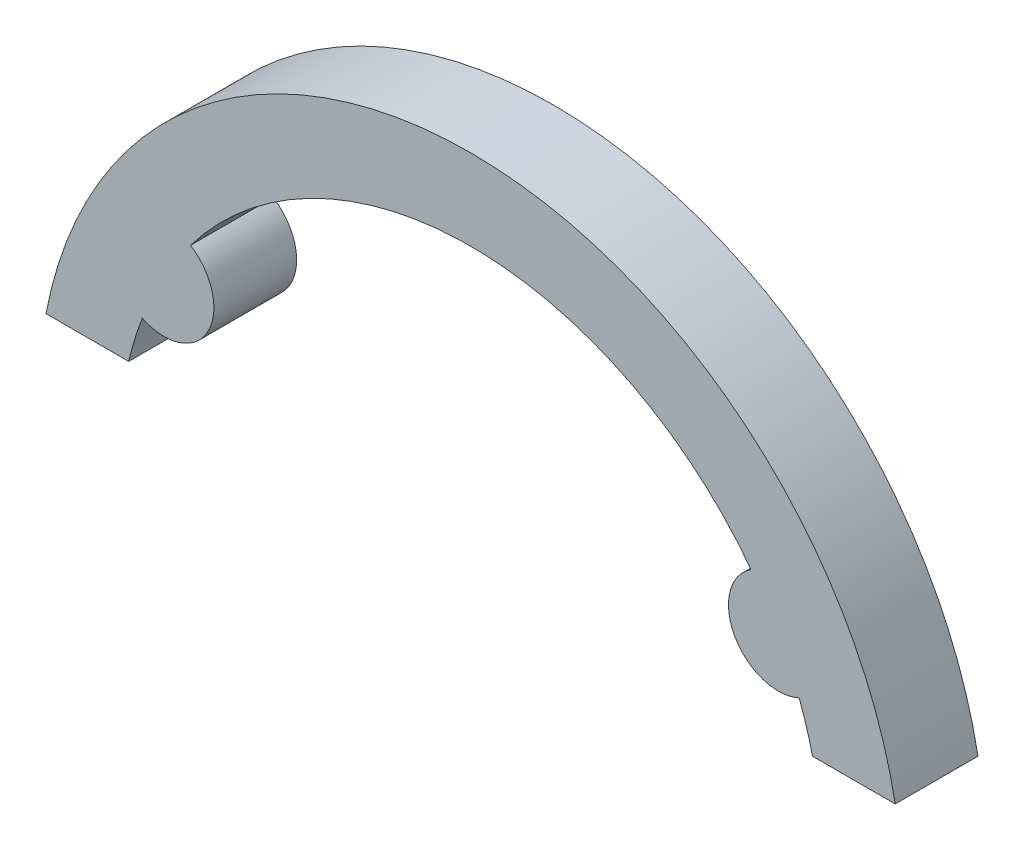
ISO-10303-21;
HEADER;
FILE_DESCRIPTION(('STEP AP214'),'2;1');
FILE_NAME('part.step','',(''),(''),'','','');
FILE_SCHEMA(('AUTOMOTIVE_DESIGN { 1 0 10303 214 1 1 1 1 }'));
ENDSEC;
DATA;
#1=APPLICATION_CONTEXT('core data for automotive mechanical design processes');
#2=APPLICATION_PROTOCOL_DEFINITION('international standard','automotive_design',2000,#1);
#3=PRODUCT_CONTEXT('',#1,'mechanical');
#4=PRODUCT('Part','Part','',(#3));
#5=PRODUCT_RELATED_PRODUCT_CATEGORY('part','',(#4));
#6=PRODUCT_DEFINITION_FORMATION('','',#4);
#7=PRODUCT_DEFINITION_CONTEXT('part definition',#1,'design');
#8=PRODUCT_DEFINITION('design','',#6,#7);
#9=PRODUCT_DEFINITION_SHAPE('','',#8);
#10=(LENGTH_UNIT() NAMED_UNIT(*) SI_UNIT(.MILLI.,.METRE.));
#11=(NAMED_UNIT(*) PLANE_ANGLE_UNIT() SI_UNIT($,.RADIAN.));
#12=(NAMED_UNIT(*) SI_UNIT($,.STERADIAN.) SOLID_ANGLE_UNIT());
#13=UNCERTAINTY_MEASURE_WITH_UNIT(LENGTH_MEASURE(1.E-05),#10,'distance_accuracy_value','');
#14=(GEOMETRIC_REPRESENTATION_CONTEXT(3) GLOBAL_UNCERTAINTY_ASSIGNED_CONTEXT((#13)) GLOBAL_UNIT_ASSIGNED_CONTEXT((#10,
#11,#12)) REPRESENTATION_CONTEXT('',''));
#15=CARTESIAN_POINT('',(0.,0.,0.));
#16=DIRECTION('',(0.,0.,1.));
#17=DIRECTION('',(1.,0.,0.));
#18=AXIS2_PLACEMENT_3D('',#15,#16,#17);
#19=CARTESIAN_POINT('',(-0.0677661190622847,0.102218067751444,9.95532087482453));
#20=DIRECTION('',(0.,0.,-1.));
#21=DIRECTION('',(-1.,0.,0.));
#22=AXIS2_PLACEMENT_3D('',#19,#20,#21);
#23=CYLINDRICAL_SURFACE('',#22,42.2489571991848);
#24=CARTESIAN_POINT('',(-0.0677661190622847,0.102218067751444,0.));
#25=DIRECTION('',(0.,0.,-1.));
#26=DIRECTION('',(-1.,0.,0.));
#27=AXIS2_PLACEMENT_3D('',#24,#25,#26);
#28=CIRCLE('',#27,42.2489571991848);
#29=CARTESIAN_POINT('',(-41.1926744496498,9.78293597601269,0.));
#30=VERTEX_POINT('',#29);
#31=CARTESIAN_POINT('',(-39.5643505188238,15.1020249055432,0.));
#32=VERTEX_POINT('',#31);
#33=EDGE_CURVE('E142',#30,#32,#28,.T.);
#34=ORIENTED_EDGE('',*,*,#33,.T.);
#35=DIRECTION('',(0.,0.,-1.));
#36=VECTOR('',#35,1.);
#37=CARTESIAN_POINT('',(-39.5643505188238,15.1020249055432,9.95532087482453));
#38=LINE('',#37,#36);
#39=CARTESIAN_POINT('',(-39.5643505188238,15.1020249055432,9.95532087482453));
#40=VERTEX_POINT('',#39);
#41=EDGE_CURVE('E11',#40,#32,#38,.T.);
#42=ORIENTED_EDGE('',*,*,#41,.F.);
#43=CARTESIAN_POINT('',(-0.0677661190622847,0.102218067751444,9.95532087482453));
#44=DIRECTION('',(0.,0.,-1.));
#45=DIRECTION('',(-1.,0.,0.));
#46=AXIS2_PLACEMENT_3D('',#43,#44,#45);
#47=CIRCLE('',#46,42.2489571991848);
#48=CARTESIAN_POINT('',(-41.1926744496498,9.78293597601269,9.95532087482453));
#49=VERTEX_POINT('',#48);
#50=EDGE_CURVE('E164',#49,#40,#47,.T.);
#51=ORIENTED_EDGE('',*,*,#50,.F.);
#52=DIRECTION('',(0.,0.,-1.));
#53=VECTOR('',#52,1.);
#54=CARTESIAN_POINT('',(-41.1926744496498,9.78293597601269,9.95532087482453));
#55=LINE('',#54,#53);
#56=EDGE_CURVE('E138',#49,#30,#55,.T.);
#57=ORIENTED_EDGE('',*,*,#56,.T.);
#58=EDGE_LOOP('',(#34,#42,#51,#57));
#59=FACE_BOUND('',#58,.T.);
#60=ADVANCED_FACE('F41',(#59),#23,.F.);
#61=CARTESIAN_POINT('',(-36.9455071674853,20.5003264440968,9.95532087482453));
#62=DIRECTION('',(0.,0.,-1.));
#63=DIRECTION('',(-1.,0.,0.));
#64=AXIS2_PLACEMENT_3D('',#61,#62,#63);
#65=CYLINDRICAL_SURFACE('',#64,5.99999999999999);
#66=CARTESIAN_POINT('',(-36.9455071674853,20.5003264440968,0.));
#67=DIRECTION('',(0.,0.,1.));
#68=DIRECTION('',(-1.,0.,0.));
#69=AXIS2_PLACEMENT_3D('',#66,#67,#68);
#70=CIRCLE('',#69,5.99999999999999);
#71=CARTESIAN_POINT('',(-33.7644557146274,25.5876549821676,0.));
#72=VERTEX_POINT('',#71);
#73=EDGE_CURVE('E146',#32,#72,#70,.T.);
#74=ORIENTED_EDGE('',*,*,#73,.T.);
#75=DIRECTION('',(0.,0.,-1.));
#76=VECTOR('',#75,1.);
#77=CARTESIAN_POINT('',(-33.7644557146274,25.5876549821676,9.95532087482453));
#78=LINE('',#77,#76);
#79=CARTESIAN_POINT('',(-33.7644557146274,25.5876549821676,9.95532087482453));
#80=VERTEX_POINT('',#79);
#81=EDGE_CURVE('E50',#80,#72,#78,.T.);
#82=ORIENTED_EDGE('',*,*,#81,.F.);
#83=CARTESIAN_POINT('',(-36.9455071674853,20.5003264440968,9.95532087482453));
#84=DIRECTION('',(0.,0.,1.));
#85=DIRECTION('',(-1.,0.,0.));
#86=AXIS2_PLACEMENT_3D('',#83,#84,#85);
#87=CIRCLE('',#86,5.99999999999999);
#88=EDGE_CURVE('E101',#40,#80,#87,.T.);
#89=ORIENTED_EDGE('',*,*,#88,.F.);
#90=ORIENTED_EDGE('',*,*,#41,.T.);
#91=EDGE_LOOP('',(#74,#82,#89,#90));
#92=FACE_BOUND('',#91,.T.);
#93=ADVANCED_FACE('F210',(#92),#65,.T.);
#94=CARTESIAN_POINT('',(-0.0677661190622847,0.102218067751444,9.95532087482453));
#95=DIRECTION('',(0.,0.,-1.));
#96=DIRECTION('',(-1.,0.,0.));
#97=AXIS2_PLACEMENT_3D('',#94,#95,#96);
#98=CYLINDRICAL_SURFACE('',#97,42.2489571991848);
#99=CARTESIAN_POINT('',(-0.0677661190622847,0.102218067751444,0.));
#100=DIRECTION('',(0.,0.,-1.));
#101=DIRECTION('',(-1.,0.,0.));
#102=AXIS2_PLACEMENT_3D('',#99,#100,#101);
#103=CIRCLE('',#102,42.2489571991848);
#104=CARTESIAN_POINT('',(33.6708272245596,25.5321552208839,0.));
#105=VERTEX_POINT('',#104);
#106=EDGE_CURVE('E149',#72,#105,#103,.T.);
#107=ORIENTED_EDGE('',*,*,#106,.T.);
#108=DIRECTION('',(0.,0.,-1.));
#109=VECTOR('',#108,1.);
#110=CARTESIAN_POINT('',(33.6708272245596,25.5321552208839,9.95532087482453));
#111=LINE('',#110,#109);
#112=CARTESIAN_POINT('',(33.6708272245596,25.5321552208839,9.95532087482453));
#113=VERTEX_POINT('',#112);
#114=EDGE_CURVE('E175',#113,#105,#111,.T.);
#115=ORIENTED_EDGE('',*,*,#114,.F.);
#116=CARTESIAN_POINT('',(-0.0677661190622847,0.102218067751444,9.95532087482453));
#117=DIRECTION('',(0.,0.,-1.));
#118=DIRECTION('',(-1.,0.,0.));
#119=AXIS2_PLACEMENT_3D('',#116,#117,#118);
#120=CIRCLE('',#119,42.2489571991848);
#121=EDGE_CURVE('E185',#80,#113,#120,.T.);
#122=ORIENTED_EDGE('',*,*,#121,.F.);
#123=ORIENTED_EDGE('',*,*,#81,.T.);
#124=EDGE_LOOP('',(#107,#115,#122,#123));
#125=FACE_BOUND('',#124,.T.);
#126=ADVANCED_FACE('F183',(#125),#98,.F.);
#127=CARTESIAN_POINT('',(36.9467034066052,20.5053634766493,9.95532087482453));
#128=DIRECTION('',(0.,0.,-1.));
#129=DIRECTION('',(-1.,0.,0.));
#130=AXIS2_PLACEMENT_3D('',#127,#128,#129);
#131=CYLINDRICAL_SURFACE('',#130,5.99999999999997);
#132=CARTESIAN_POINT('',(36.9467034066052,20.5053634766493,0.));
#133=DIRECTION('',(0.,0.,1.));
#134=DIRECTION('',(1.,0.,0.));
#135=AXIS2_PLACEMENT_3D('',#132,#133,#134);
#136=CIRCLE('',#135,5.99999999999997);
#137=CARTESIAN_POINT('',(39.4479410799773,15.0515748759329,0.));
#138=VERTEX_POINT('',#137);
#139=EDGE_CURVE('E152',#105,#138,#136,.T.);
#140=ORIENTED_EDGE('',*,*,#139,.T.);
#141=DIRECTION('',(0.,0.,-1.));
#142=VECTOR('',#141,1.);
#143=CARTESIAN_POINT('',(39.4479410799773,15.0515748759329,9.95532087482453));
#144=LINE('',#143,#142);
#145=CARTESIAN_POINT('',(39.4479410799773,15.0515748759329,9.95532087482453));
#146=VERTEX_POINT('',#145);
#147=EDGE_CURVE('E171',#146,#138,#144,.T.);
#148=ORIENTED_EDGE('',*,*,#147,.F.);
#149=CARTESIAN_POINT('',(36.9467034066052,20.5053634766493,9.95532087482453));
#150=DIRECTION('',(0.,0.,1.));
#151=DIRECTION('',(1.,0.,0.));
#152=AXIS2_PLACEMENT_3D('',#149,#150,#151);
#153=CIRCLE('',#152,5.99999999999997);
#154=EDGE_CURVE('E198',#113,#146,#153,.T.);
#155=ORIENTED_EDGE('',*,*,#154,.F.);
#156=ORIENTED_EDGE('',*,*,#114,.T.);
#157=EDGE_LOOP('',(#140,#148,#155,#156));
#158=FACE_BOUND('',#157,.T.);
#159=ADVANCED_FACE('F193',(#158),#131,.T.);
#160=CARTESIAN_POINT('',(-0.0677661190622847,0.102218067751444,9.95532087482453));
#161=DIRECTION('',(0.,0.,-1.));
#162=DIRECTION('',(-1.,0.,0.));
#163=AXIS2_PLACEMENT_3D('',#160,#161,#162);
#164=CYLINDRICAL_SURFACE('',#163,42.2489571991848);
#165=CARTESIAN_POINT('',(-0.0677661190622847,0.102218067751444,0.));
#166=DIRECTION('',(0.,0.,-1.));
#167=DIRECTION('',(-1.,0.,0.));
#168=AXIS2_PLACEMENT_3D('',#165,#166,#167);
#169=CIRCLE('',#168,42.2489571991848);
#170=CARTESIAN_POINT('',(41.0566856908134,9.78487512848466,0.));
#171=VERTEX_POINT('',#170);
#172=EDGE_CURVE('E155',#138,#171,#169,.T.);
#173=ORIENTED_EDGE('',*,*,#172,.T.);
#174=DIRECTION('',(0.,0.,-1.));
#175=VECTOR('',#174,1.);
#176=CARTESIAN_POINT('',(41.0566856908134,9.78487512848466,9.95532087482453));
#177=LINE('',#176,#175);
#178=CARTESIAN_POINT('',(41.0566856908134,9.78487512848466,9.95532087482453));
#179=VERTEX_POINT('',#178);
#180=EDGE_CURVE('E131',#179,#171,#177,.T.);
#181=ORIENTED_EDGE('',*,*,#180,.F.);
#182=CARTESIAN_POINT('',(-0.0677661190622847,0.102218067751444,9.95532087482453));
#183=DIRECTION('',(0.,0.,-1.));
#184=DIRECTION('',(-1.,0.,0.));
#185=AXIS2_PLACEMENT_3D('',#182,#183,#184);
#186=CIRCLE('',#185,42.2489571991848);
#187=EDGE_CURVE('E120',#146,#179,#186,.T.);
#188=ORIENTED_EDGE('',*,*,#187,.F.);
#189=ORIENTED_EDGE('',*,*,#147,.T.);
#190=EDGE_LOOP('',(#173,#181,#188,#189));
#191=FACE_BOUND('',#190,.T.);
#192=ADVANCED_FACE('F196',(#191),#164,.F.);
#193=CARTESIAN_POINT('',(41.0566856908134,9.78487512848466,9.95532087482453));
#194=DIRECTION('',(9.74706112551038E-05,0.99999999524974,0.));
#195=DIRECTION('',(-0.99999999524974,9.74706112551038E-05,0.));
#196=AXIS2_PLACEMENT_3D('',#193,#194,#195);
#197=PLANE('',#196);
#198=DIRECTION('',(0.99999999524974,-9.74706112551038E-05,0.));
#199=VECTOR('',#198,1.);
#200=CARTESIAN_POINT('',(41.0566856908134,9.78487512848466,0.));
#201=LINE('',#200,#199);
#202=CARTESIAN_POINT('',(51.0042839213623,9.78390553000001,0.));
#203=VERTEX_POINT('',#202);
#204=EDGE_CURVE('E129',#171,#203,#201,.T.);
#205=ORIENTED_EDGE('',*,*,#204,.T.);
#206=DIRECTION('',(0.,0.,-1.));
#207=VECTOR('',#206,1.);
#208=CARTESIAN_POINT('',(51.0042839213623,9.78390553000001,9.95532087482453));
#209=LINE('',#208,#207);
#210=CARTESIAN_POINT('',(51.0042839213623,9.78390553000001,9.95532087482453));
#211=VERTEX_POINT('',#210);
#212=EDGE_CURVE('E126',#211,#203,#209,.T.);
#213=ORIENTED_EDGE('',*,*,#212,.F.);
#214=DIRECTION('',(0.99999999524974,-9.74706112551038E-05,0.));
#215=VECTOR('',#214,1.);
#216=CARTESIAN_POINT('',(41.0566856908134,9.78487512848466,9.95532087482453));
#217=LINE('',#216,#215);
#218=EDGE_CURVE('E114',#179,#211,#217,.T.);
#219=ORIENTED_EDGE('',*,*,#218,.F.);
#220=ORIENTED_EDGE('',*,*,#180,.T.);
#221=EDGE_LOOP('',(#205,#213,#219,#220));
#222=FACE_BOUND('',#221,.T.);
#223=ADVANCED_FACE('F127',(#222),#197,.F.);
#224=CARTESIAN_POINT('',(-0.0677661190622847,0.102218067751444,9.95532087482453));
#225=DIRECTION('',(0.,0.,-1.));
#226=DIRECTION('',(-1.,0.,0.));
#227=AXIS2_PLACEMENT_3D('',#224,#225,#226);
#228=CYLINDRICAL_SURFACE('',#227,51.9816252867135);
#229=CARTESIAN_POINT('',(-0.0677661190622847,0.102218067751444,0.));
#230=DIRECTION('',(0.,0.,1.));
#231=DIRECTION('',(-1.,0.,0.));
#232=AXIS2_PLACEMENT_3D('',#229,#230,#231);
#233=CIRCLE('',#232,51.9816252867135);
#234=CARTESIAN_POINT('',(-51.1398161594869,9.78390553,0.));
#235=VERTEX_POINT('',#234);
#236=EDGE_CURVE('E87',#203,#235,#233,.T.);
#237=ORIENTED_EDGE('',*,*,#236,.T.);
#238=DIRECTION('',(0.,0.,-1.));
#239=VECTOR('',#238,1.);
#240=CARTESIAN_POINT('',(-51.1398161594869,9.78390553,9.95532087482453));
#241=LINE('',#240,#239);
#242=CARTESIAN_POINT('',(-51.1398161594869,9.78390553,9.95532087482453));
#243=VERTEX_POINT('',#242);
#244=EDGE_CURVE('E132',#243,#235,#241,.T.);
#245=ORIENTED_EDGE('',*,*,#244,.F.);
#246=CARTESIAN_POINT('',(-0.0677661190622847,0.102218067751444,9.95532087482453));
#247=DIRECTION('',(0.,0.,1.));
#248=DIRECTION('',(-1.,0.,0.));
#249=AXIS2_PLACEMENT_3D('',#246,#247,#248);
#250=CIRCLE('',#249,51.9816252867135);
#251=EDGE_CURVE('E118',#211,#243,#250,.T.);
#252=ORIENTED_EDGE('',*,*,#251,.F.);
#253=ORIENTED_EDGE('',*,*,#212,.T.);
#254=EDGE_LOOP('',(#237,#245,#252,#253));
#255=FACE_BOUND('',#254,.T.);
#256=ADVANCED_FACE('F134',(#255),#228,.T.);
#257=CARTESIAN_POINT('',(-51.1398161594869,9.78390553,9.95532087482453));
#258=DIRECTION('',(9.74706112552102E-05,0.99999999524974,0.));
#259=DIRECTION('',(-0.99999999524974,9.74706112552102E-05,0.));
#260=AXIS2_PLACEMENT_3D('',#257,#258,#259);
#261=PLANE('',#260);
#262=DIRECTION('',(0.99999999524974,-9.74706112552102E-05,0.));
#263=VECTOR('',#262,1.);
#264=CARTESIAN_POINT('',(-51.1398161594869,9.78390553,0.));
#265=LINE('',#264,#263);
#266=EDGE_CURVE('E93',#235,#30,#265,.T.);
#267=ORIENTED_EDGE('',*,*,#266,.T.);
#268=ORIENTED_EDGE('',*,*,#56,.F.);
#269=DIRECTION('',(0.99999999524974,-9.74706112552102E-05,0.));
#270=VECTOR('',#269,1.);
#271=CARTESIAN_POINT('',(-51.1398161594869,9.78390553,9.95532087482453));
#272=LINE('',#271,#270);
#273=EDGE_CURVE('E58',#243,#49,#272,.T.);
#274=ORIENTED_EDGE('',*,*,#273,.F.);
#275=ORIENTED_EDGE('',*,*,#244,.T.);
#276=EDGE_LOOP('',(#267,#268,#274,#275));
#277=FACE_BOUND('',#276,.T.);
#278=ADVANCED_FACE('F226',(#277),#261,.F.);
#279=CARTESIAN_POINT('',(-0.0677661190622847,0.102218067751444,9.95532087482453));
#280=DIRECTION('',(0.,0.,-1.));
#281=DIRECTION('',(-1.,0.,0.));
#282=AXIS2_PLACEMENT_3D('',#279,#280,#281);
#283=PLANE('',#282);
#284=ORIENTED_EDGE('',*,*,#50,.T.);
#285=ORIENTED_EDGE('',*,*,#88,.T.);
#286=ORIENTED_EDGE('',*,*,#121,.T.);
#287=ORIENTED_EDGE('',*,*,#154,.T.);
#288=ORIENTED_EDGE('',*,*,#187,.T.);
#289=ORIENTED_EDGE('',*,*,#218,.T.);
#290=ORIENTED_EDGE('',*,*,#251,.T.);
#291=ORIENTED_EDGE('',*,*,#273,.T.);
#292=EDGE_LOOP('',(#284,#285,#286,#287,#288,#289,#290,#291));
#293=FACE_BOUND('',#292,.T.);
#294=ADVANCED_FACE('F116',(#293),#283,.F.);
#295=CARTESIAN_POINT('',(-0.0677661190622847,0.102218067751444,0.));
#296=DIRECTION('',(0.,0.,-1.));
#297=DIRECTION('',(-1.,0.,0.));
#298=AXIS2_PLACEMENT_3D('',#295,#296,#297);
#299=PLANE('',#298);
#300=ORIENTED_EDGE('',*,*,#33,.F.);
#301=ORIENTED_EDGE('',*,*,#266,.F.);
#302=ORIENTED_EDGE('',*,*,#236,.F.);
#303=ORIENTED_EDGE('',*,*,#204,.F.);
#304=ORIENTED_EDGE('',*,*,#172,.F.);
#305=ORIENTED_EDGE('',*,*,#139,.F.);
#306=ORIENTED_EDGE('',*,*,#106,.F.);
#307=ORIENTED_EDGE('',*,*,#73,.F.);
#308=EDGE_LOOP('',(#300,#301,#302,#303,#304,#305,#306,#307));
#309=FACE_BOUND('',#308,.T.);
#310=ADVANCED_FACE('F189',(#309),#299,.T.);
#311=CLOSED_SHELL('',(#60,#93,#126,#159,#192,#223,#256,#278,#294,#310));
#312=MANIFOLD_SOLID_BREP('B2',#311);
#313=ADVANCED_BREP_SHAPE_REPRESENTATION('',(#18,#312),#14);
#314=SHAPE_DEFINITION_REPRESENTATION(#9,#313);
ENDSEC;
END-ISO-10303-21;
